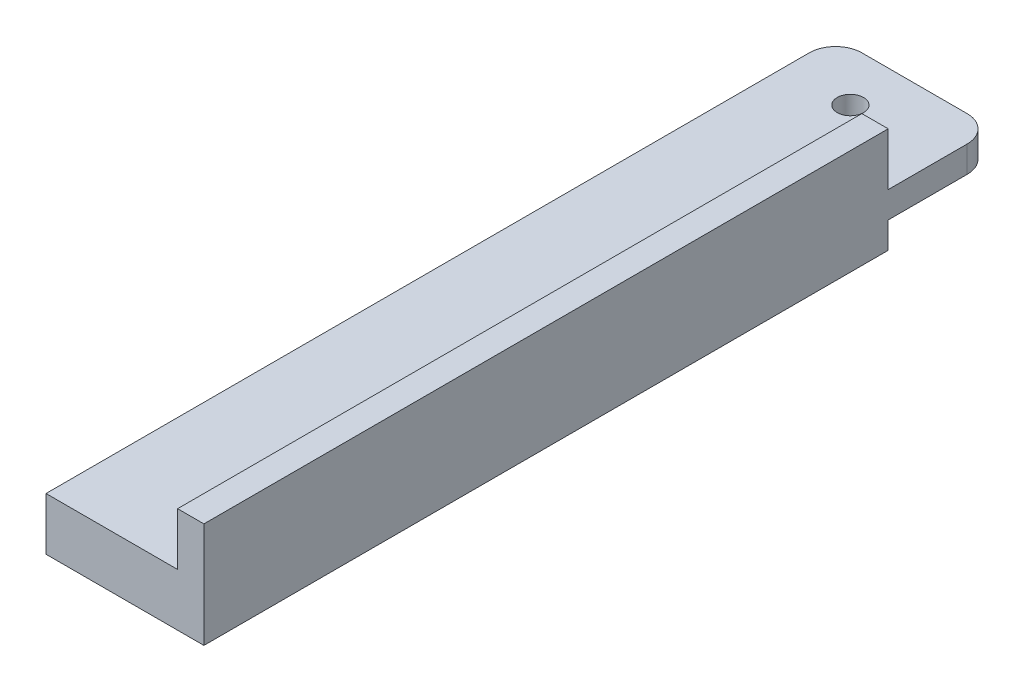
ISO-10303-21;
HEADER;
FILE_DESCRIPTION(('STEP AP214'),'2;1');
FILE_NAME('part.step','',(''),(''),'','','');
FILE_SCHEMA(('AUTOMOTIVE_DESIGN { 1 0 10303 214 1 1 1 1 }'));
ENDSEC;
DATA;
#1=APPLICATION_CONTEXT('core data for automotive mechanical design processes');
#2=APPLICATION_PROTOCOL_DEFINITION('international standard','automotive_design',2000,#1);
#3=PRODUCT_CONTEXT('',#1,'mechanical');
#4=PRODUCT('Part','Part','',(#3));
#5=PRODUCT_RELATED_PRODUCT_CATEGORY('part','',(#4));
#6=PRODUCT_DEFINITION_FORMATION('','',#4);
#7=PRODUCT_DEFINITION_CONTEXT('part definition',#1,'design');
#8=PRODUCT_DEFINITION('design','',#6,#7);
#9=PRODUCT_DEFINITION_SHAPE('','',#8);
#10=(LENGTH_UNIT() NAMED_UNIT(*) SI_UNIT(.MILLI.,.METRE.));
#11=(NAMED_UNIT(*) PLANE_ANGLE_UNIT() SI_UNIT($,.RADIAN.));
#12=(NAMED_UNIT(*) SI_UNIT($,.STERADIAN.) SOLID_ANGLE_UNIT());
#13=UNCERTAINTY_MEASURE_WITH_UNIT(LENGTH_MEASURE(1.E-05),#10,'distance_accuracy_value','');
#14=(GEOMETRIC_REPRESENTATION_CONTEXT(3) GLOBAL_UNCERTAINTY_ASSIGNED_CONTEXT((#13)) GLOBAL_UNIT_ASSIGNED_CONTEXT((#10,
#11,#12)) REPRESENTATION_CONTEXT('',''));
#15=CARTESIAN_POINT('',(0.,0.,0.));
#16=DIRECTION('',(0.,0.,1.));
#17=DIRECTION('',(1.,0.,0.));
#18=AXIS2_PLACEMENT_3D('',#15,#16,#17);
#19=CARTESIAN_POINT('',(10.,0.,300.));
#20=DIRECTION('',(0.,-1.,0.));
#21=DIRECTION('',(1.,0.,0.));
#22=AXIS2_PLACEMENT_3D('',#19,#20,#21);
#23=PLANE('',#22);
#24=DIRECTION('',(-1.,0.,0.));
#25=VECTOR('',#24,1.);
#26=CARTESIAN_POINT('',(10.,0.,300.));
#27=LINE('',#26,#25);
#28=CARTESIAN_POINT('',(0.,0.,300.));
#29=VERTEX_POINT('',#28);
#30=CARTESIAN_POINT('',(-10.,0.,300.));
#31=VERTEX_POINT('',#30);
#32=EDGE_CURVE('E152',#29,#31,#27,.T.);
#33=ORIENTED_EDGE('',*,*,#32,.F.);
#34=DIRECTION('',(0.,0.,1.));
#35=VECTOR('',#34,1.);
#36=CARTESIAN_POINT('',(0.,0.,-26.7380079323497));
#37=LINE('',#36,#35);
#38=CARTESIAN_POINT('',(0.,0.,40.));
#39=VERTEX_POINT('',#38);
#40=EDGE_CURVE('E130',#39,#29,#37,.T.);
#41=ORIENTED_EDGE('',*,*,#40,.F.);
#42=DIRECTION('',(1.,0.,0.));
#43=VECTOR('',#42,1.);
#44=CARTESIAN_POINT('',(0.,0.,40.));
#45=LINE('',#44,#43);
#46=CARTESIAN_POINT('',(-10.,0.,40.));
#47=VERTEX_POINT('',#46);
#48=EDGE_CURVE('E207',#47,#39,#45,.T.);
#49=ORIENTED_EDGE('',*,*,#48,.F.);
#50=DIRECTION('',(0.,0.,-1.));
#51=VECTOR('',#50,1.);
#52=CARTESIAN_POINT('',(-10.,0.,300.));
#53=LINE('',#52,#51);
#54=EDGE_CURVE('E200',#31,#47,#53,.T.);
#55=ORIENTED_EDGE('',*,*,#54,.F.);
#56=EDGE_LOOP('',(#33,#41,#49,#55));
#57=FACE_BOUND('',#56,.T.);
#58=ADVANCED_FACE('F40',(#57),#23,.F.);
#59=CARTESIAN_POINT('',(0.,-40.,300.));
#60=DIRECTION('',(0.,1.,0.));
#61=DIRECTION('',(-1.,0.,0.));
#62=AXIS2_PLACEMENT_3D('',#59,#60,#61);
#63=PLANE('',#62);
#64=DIRECTION('',(-1.,0.,0.));
#65=VECTOR('',#64,1.);
#66=CARTESIAN_POINT('',(60.,-40.,40.));
#67=LINE('',#66,#65);
#68=CARTESIAN_POINT('',(1.04083408558608E-13,-40.,40.));
#69=VERTEX_POINT('',#68);
#70=CARTESIAN_POINT('',(-60.,-40.,40.));
#71=VERTEX_POINT('',#70);
#72=EDGE_CURVE('E143',#69,#71,#67,.T.);
#73=ORIENTED_EDGE('',*,*,#72,.F.);
#74=DIRECTION('',(0.,0.,1.));
#75=VECTOR('',#74,1.);
#76=CARTESIAN_POINT('',(1.01436593500756E-13,-40.0000000000002,-26.7380079323497));
#77=LINE('',#76,#75);
#78=CARTESIAN_POINT('',(1.01540273924714E-13,-40.0000000000002,300.));
#79=VERTEX_POINT('',#78);
#80=EDGE_CURVE('E127',#69,#79,#77,.T.);
#81=ORIENTED_EDGE('',*,*,#80,.T.);
#82=DIRECTION('',(1.,0.,0.));
#83=VECTOR('',#82,1.);
#84=CARTESIAN_POINT('',(0.,-40.,300.));
#85=LINE('',#84,#83);
#86=CARTESIAN_POINT('',(-60.,-40.,300.));
#87=VERTEX_POINT('',#86);
#88=EDGE_CURVE('E141',#87,#79,#85,.T.);
#89=ORIENTED_EDGE('',*,*,#88,.F.);
#90=DIRECTION('',(0.,0.,-1.));
#91=VECTOR('',#90,1.);
#92=CARTESIAN_POINT('',(-60.,-40.,300.));
#93=LINE('',#92,#91);
#94=EDGE_CURVE('E197',#87,#71,#93,.T.);
#95=ORIENTED_EDGE('',*,*,#94,.T.);
#96=EDGE_LOOP('',(#73,#81,#89,#95));
#97=FACE_BOUND('',#96,.T.);
#98=ADVANCED_FACE('F139',(#97),#63,.F.);
#99=CARTESIAN_POINT('',(0.,0.,0.));
#100=DIRECTION('',(0.,0.,1.));
#101=DIRECTION('',(1.,0.,0.));
#102=AXIS2_PLACEMENT_3D('',#99,#100,#101);
#103=PLANE('',#102);
#104=DIRECTION('',(1.,0.,0.));
#105=VECTOR('',#104,1.);
#106=CARTESIAN_POINT('',(10.,-30.,0.));
#107=LINE('',#106,#105);
#108=CARTESIAN_POINT('',(-50.,-30.,0.));
#109=VERTEX_POINT('',#108);
#110=CARTESIAN_POINT('',(-9.99999999999993,-30.,0.));
#111=VERTEX_POINT('',#110);
#112=EDGE_CURVE('E179',#109,#111,#107,.T.);
#113=ORIENTED_EDGE('',*,*,#112,.F.);
#114=DIRECTION('',(0.,1.,0.));
#115=VECTOR('',#114,1.);
#116=CARTESIAN_POINT('',(-50.,-20.,0.));
#117=LINE('',#116,#115);
#118=CARTESIAN_POINT('',(-50.,-20.,0.));
#119=VERTEX_POINT('',#118);
#120=EDGE_CURVE('E168',#109,#119,#117,.T.);
#121=ORIENTED_EDGE('',*,*,#120,.T.);
#122=DIRECTION('',(-1.,0.,0.));
#123=VECTOR('',#122,1.);
#124=CARTESIAN_POINT('',(60.,-19.9999999999999,0.));
#125=LINE('',#124,#123);
#126=CARTESIAN_POINT('',(-9.99999999999995,-20.,0.));
#127=VERTEX_POINT('',#126);
#128=EDGE_CURVE('E156',#127,#119,#125,.T.);
#129=ORIENTED_EDGE('',*,*,#128,.F.);
#130=DIRECTION('',(0.,-1.,0.));
#131=VECTOR('',#130,1.);
#132=CARTESIAN_POINT('',(-10.,0.,0.));
#133=LINE('',#132,#131);
#134=EDGE_CURVE('E154',#127,#111,#133,.T.);
#135=ORIENTED_EDGE('',*,*,#134,.T.);
#136=EDGE_LOOP('',(#113,#121,#129,#135));
#137=FACE_BOUND('',#136,.T.);
#138=ADVANCED_FACE('F184',(#137),#103,.F.);
#139=CARTESIAN_POINT('',(-9.99999999999999,-20.,300.));
#140=DIRECTION('',(-1.,0.,0.));
#141=DIRECTION('',(0.,-1.,0.));
#142=AXIS2_PLACEMENT_3D('',#139,#140,#141);
#143=PLANE('',#142);
#144=ORIENTED_EDGE('',*,*,#54,.T.);
#145=DIRECTION('',(0.,-1.,0.));
#146=VECTOR('',#145,1.);
#147=CARTESIAN_POINT('',(-10.,0.,40.));
#148=LINE('',#147,#146);
#149=CARTESIAN_POINT('',(-9.99999999999999,-20.,40.));
#150=VERTEX_POINT('',#149);
#151=EDGE_CURVE('E164',#47,#150,#148,.T.);
#152=ORIENTED_EDGE('',*,*,#151,.T.);
#153=DIRECTION('',(0.,0.,-1.));
#154=VECTOR('',#153,1.);
#155=CARTESIAN_POINT('',(-9.99999999999999,-20.,300.));
#156=LINE('',#155,#154);
#157=CARTESIAN_POINT('',(-9.99999999999999,-20.,300.));
#158=VERTEX_POINT('',#157);
#159=EDGE_CURVE('E196',#158,#150,#156,.T.);
#160=ORIENTED_EDGE('',*,*,#159,.F.);
#161=DIRECTION('',(0.,1.,0.));
#162=VECTOR('',#161,1.);
#163=CARTESIAN_POINT('',(-9.99999999999999,-20.,300.));
#164=LINE('',#163,#162);
#165=EDGE_CURVE('E227',#158,#31,#164,.T.);
#166=ORIENTED_EDGE('',*,*,#165,.T.);
#167=EDGE_LOOP('',(#144,#152,#160,#166));
#168=FACE_BOUND('',#167,.T.);
#169=ADVANCED_FACE('F220',(#168),#143,.T.);
#170=CARTESIAN_POINT('',(-60.,-40.,300.));
#171=DIRECTION('',(-1.,0.,0.));
#172=DIRECTION('',(0.,-1.,0.));
#173=AXIS2_PLACEMENT_3D('',#170,#171,#172);
#174=PLANE('',#173);
#175=DIRECTION('',(0.,0.,-1.));
#176=VECTOR('',#175,1.);
#177=CARTESIAN_POINT('',(-60.,-20.,300.));
#178=LINE('',#177,#176);
#179=CARTESIAN_POINT('',(-60.,-20.,300.));
#180=VERTEX_POINT('',#179);
#181=CARTESIAN_POINT('',(-60.,-20.,10.));
#182=VERTEX_POINT('',#181);
#183=EDGE_CURVE('E194',#180,#182,#178,.T.);
#184=ORIENTED_EDGE('',*,*,#183,.T.);
#185=DIRECTION('',(0.,1.,0.));
#186=VECTOR('',#185,1.);
#187=CARTESIAN_POINT('',(-60.,-30.,10.));
#188=LINE('',#187,#186);
#189=CARTESIAN_POINT('',(-60.,-30.,10.));
#190=VERTEX_POINT('',#189);
#191=EDGE_CURVE('E63',#182,#190,#188,.F.);
#192=ORIENTED_EDGE('',*,*,#191,.T.);
#193=DIRECTION('',(0.,0.,-1.));
#194=VECTOR('',#193,1.);
#195=CARTESIAN_POINT('',(-60.,-30.,40.));
#196=LINE('',#195,#194);
#197=CARTESIAN_POINT('',(-60.,-30.,40.));
#198=VERTEX_POINT('',#197);
#199=EDGE_CURVE('E180',#198,#190,#196,.T.);
#200=ORIENTED_EDGE('',*,*,#199,.F.);
#201=DIRECTION('',(0.,-1.,0.));
#202=VECTOR('',#201,1.);
#203=CARTESIAN_POINT('',(-60.,-30.,40.));
#204=LINE('',#203,#202);
#205=EDGE_CURVE('E224',#198,#71,#204,.T.);
#206=ORIENTED_EDGE('',*,*,#205,.T.);
#207=ORIENTED_EDGE('',*,*,#94,.F.);
#208=DIRECTION('',(0.,1.,0.));
#209=VECTOR('',#208,1.);
#210=CARTESIAN_POINT('',(-60.,-40.,300.));
#211=LINE('',#210,#209);
#212=EDGE_CURVE('E150',#87,#180,#211,.T.);
#213=ORIENTED_EDGE('',*,*,#212,.T.);
#214=EDGE_LOOP('',(#184,#192,#200,#206,#207,#213));
#215=FACE_BOUND('',#214,.T.);
#216=ADVANCED_FACE('F195',(#215),#174,.T.);
#217=CARTESIAN_POINT('',(60.,-19.9999999999999,300.));
#218=DIRECTION('',(0.,-1.,0.));
#219=DIRECTION('',(1.,0.,0.));
#220=AXIS2_PLACEMENT_3D('',#217,#218,#219);
#221=PLANE('',#220);
#222=CARTESIAN_POINT('',(-35.,-20.,19.3649167310371));
#223=DIRECTION('',(0.,-1.,0.));
#224=DIRECTION('',(1.,0.,0.));
#225=AXIS2_PLACEMENT_3D('',#222,#223,#224);
#226=CIRCLE('',#225,5.);
#227=CARTESIAN_POINT('',(-30.,-20.,19.3649167310371));
#228=VERTEX_POINT('',#227);
#229=EDGE_CURVE('E134',#228,#228,#226,.T.);
#230=ORIENTED_EDGE('',*,*,#229,.T.);
#231=EDGE_LOOP('',(#230));
#232=FACE_BOUND('',#231,.T.);
#233=ORIENTED_EDGE('',*,*,#128,.T.);
#234=CARTESIAN_POINT('',(-50.,-20.,10.));
#235=DIRECTION('',(0.,-1.,0.));
#236=DIRECTION('',(1.,0.,0.));
#237=AXIS2_PLACEMENT_3D('',#234,#235,#236);
#238=CIRCLE('',#237,10.);
#239=EDGE_CURVE('E173',#119,#182,#238,.F.);
#240=ORIENTED_EDGE('',*,*,#239,.T.);
#241=ORIENTED_EDGE('',*,*,#183,.F.);
#242=DIRECTION('',(1.,0.,0.));
#243=VECTOR('',#242,1.);
#244=CARTESIAN_POINT('',(-60.,-20.,300.));
#245=LINE('',#244,#243);
#246=EDGE_CURVE('E226',#180,#158,#245,.T.);
#247=ORIENTED_EDGE('',*,*,#246,.T.);
#248=ORIENTED_EDGE('',*,*,#159,.T.);
#249=DIRECTION('',(-1.,0.,0.));
#250=VECTOR('',#249,1.);
#251=CARTESIAN_POINT('',(10.,-20.,40.));
#252=LINE('',#251,#250);
#253=CARTESIAN_POINT('',(0.,-19.9999999999999,40.));
#254=VERTEX_POINT('',#253);
#255=EDGE_CURVE('E188',#254,#150,#252,.T.);
#256=ORIENTED_EDGE('',*,*,#255,.F.);
#257=DIRECTION('',(0.,0.,-1.));
#258=VECTOR('',#257,1.);
#259=CARTESIAN_POINT('',(0.,-19.9999999999999,300.));
#260=LINE('',#259,#258);
#261=CARTESIAN_POINT('',(0.,-19.9999999999999,10.));
#262=VERTEX_POINT('',#261);
#263=EDGE_CURVE('E237',#254,#262,#260,.T.);
#264=ORIENTED_EDGE('',*,*,#263,.T.);
#265=CARTESIAN_POINT('',(-9.99999999999995,-20.,10.));
#266=DIRECTION('',(0.,-1.,0.));
#267=DIRECTION('',(1.,0.,0.));
#268=AXIS2_PLACEMENT_3D('',#265,#266,#267);
#269=CIRCLE('',#268,10.);
#270=EDGE_CURVE('E171',#262,#127,#269,.F.);
#271=ORIENTED_EDGE('',*,*,#270,.T.);
#272=EDGE_LOOP('',(#233,#240,#241,#247,#248,#256,#264,#271));
#273=FACE_BOUND('',#272,.T.);
#274=ADVANCED_FACE('F192',(#232,#273),#221,.F.);
#275=CARTESIAN_POINT('',(0.,0.,300.));
#276=DIRECTION('',(0.,0.,1.));
#277=DIRECTION('',(1.,0.,0.));
#278=AXIS2_PLACEMENT_3D('',#275,#276,#277);
#279=PLANE('',#278);
#280=DIRECTION('',(0.,-1.,0.));
#281=VECTOR('',#280,1.);
#282=CARTESIAN_POINT('',(0.,0.,300.));
#283=LINE('',#282,#281);
#284=EDGE_CURVE('E123',#29,#79,#283,.T.);
#285=ORIENTED_EDGE('',*,*,#284,.F.);
#286=ORIENTED_EDGE('',*,*,#32,.T.);
#287=ORIENTED_EDGE('',*,*,#165,.F.);
#288=ORIENTED_EDGE('',*,*,#246,.F.);
#289=ORIENTED_EDGE('',*,*,#212,.F.);
#290=ORIENTED_EDGE('',*,*,#88,.T.);
#291=EDGE_LOOP('',(#285,#286,#287,#288,#289,#290));
#292=FACE_BOUND('',#291,.T.);
#293=ADVANCED_FACE('F147',(#292),#279,.T.);
#294=CARTESIAN_POINT('',(0.,0.,40.));
#295=DIRECTION('',(0.,0.,-1.));
#296=DIRECTION('',(-1.,0.,0.));
#297=AXIS2_PLACEMENT_3D('',#294,#295,#296);
#298=PLANE('',#297);
#299=DIRECTION('',(0.,1.,0.));
#300=VECTOR('',#299,1.);
#301=CARTESIAN_POINT('',(0.,0.,40.));
#302=LINE('',#301,#300);
#303=EDGE_CURVE('E135',#254,#39,#302,.T.);
#304=ORIENTED_EDGE('',*,*,#303,.F.);
#305=ORIENTED_EDGE('',*,*,#255,.T.);
#306=ORIENTED_EDGE('',*,*,#151,.F.);
#307=ORIENTED_EDGE('',*,*,#48,.T.);
#308=EDGE_LOOP('',(#304,#305,#306,#307));
#309=FACE_BOUND('',#308,.T.);
#310=ADVANCED_FACE('F217',(#309),#298,.T.);
#311=CARTESIAN_POINT('',(10.,-30.,40.));
#312=DIRECTION('',(0.,1.,0.));
#313=DIRECTION('',(0.,0.,1.));
#314=AXIS2_PLACEMENT_3D('',#311,#312,#313);
#315=PLANE('',#314);
#316=CARTESIAN_POINT('',(-35.,-30.,19.3649167310371));
#317=DIRECTION('',(0.,1.,0.));
#318=DIRECTION('',(0.,0.,1.));
#319=AXIS2_PLACEMENT_3D('',#316,#317,#318);
#320=CIRCLE('',#319,5.);
#321=CARTESIAN_POINT('',(-35.,-30.,24.3649167310371));
#322=VERTEX_POINT('',#321);
#323=EDGE_CURVE('E162',#322,#322,#320,.F.);
#324=ORIENTED_EDGE('',*,*,#323,.F.);
#325=EDGE_LOOP('',(#324));
#326=FACE_BOUND('',#325,.T.);
#327=ORIENTED_EDGE('',*,*,#199,.T.);
#328=CARTESIAN_POINT('',(-50.,-30.,10.));
#329=DIRECTION('',(0.,1.,0.));
#330=DIRECTION('',(0.,0.,1.));
#331=AXIS2_PLACEMENT_3D('',#328,#329,#330);
#332=CIRCLE('',#331,10.);
#333=EDGE_CURVE('E48',#190,#109,#332,.F.);
#334=ORIENTED_EDGE('',*,*,#333,.T.);
#335=ORIENTED_EDGE('',*,*,#112,.T.);
#336=CARTESIAN_POINT('',(-9.99999999999993,-30.,10.));
#337=DIRECTION('',(0.,1.,0.));
#338=DIRECTION('',(0.,0.,1.));
#339=AXIS2_PLACEMENT_3D('',#336,#337,#338);
#340=CIRCLE('',#339,10.);
#341=CARTESIAN_POINT('',(0.,-30.,10.));
#342=VERTEX_POINT('',#341);
#343=EDGE_CURVE('E55',#111,#342,#340,.F.);
#344=ORIENTED_EDGE('',*,*,#343,.T.);
#345=DIRECTION('',(0.,0.,1.));
#346=VECTOR('',#345,1.);
#347=CARTESIAN_POINT('',(0.,-30.,40.));
#348=LINE('',#347,#346);
#349=CARTESIAN_POINT('',(0.,-30.,40.));
#350=VERTEX_POINT('',#349);
#351=EDGE_CURVE('E144',#342,#350,#348,.T.);
#352=ORIENTED_EDGE('',*,*,#351,.T.);
#353=DIRECTION('',(1.,0.,0.));
#354=VECTOR('',#353,1.);
#355=CARTESIAN_POINT('',(10.,-30.,40.));
#356=LINE('',#355,#354);
#357=EDGE_CURVE('E187',#198,#350,#356,.T.);
#358=ORIENTED_EDGE('',*,*,#357,.F.);
#359=EDGE_LOOP('',(#327,#334,#335,#344,#352,#358));
#360=FACE_BOUND('',#359,.T.);
#361=ADVANCED_FACE('F178',(#326,#360),#315,.F.);
#362=CARTESIAN_POINT('',(0.,0.,40.));
#363=DIRECTION('',(0.,0.,-1.));
#364=DIRECTION('',(-1.,0.,0.));
#365=AXIS2_PLACEMENT_3D('',#362,#363,#364);
#366=PLANE('',#365);
#367=DIRECTION('',(0.,1.,0.));
#368=VECTOR('',#367,1.);
#369=CARTESIAN_POINT('',(0.,0.,40.));
#370=LINE('',#369,#368);
#371=EDGE_CURVE('E151',#69,#350,#370,.T.);
#372=ORIENTED_EDGE('',*,*,#371,.F.);
#373=ORIENTED_EDGE('',*,*,#72,.T.);
#374=ORIENTED_EDGE('',*,*,#205,.F.);
#375=ORIENTED_EDGE('',*,*,#357,.T.);
#376=EDGE_LOOP('',(#372,#373,#374,#375));
#377=FACE_BOUND('',#376,.T.);
#378=ADVANCED_FACE('F243',(#377),#366,.T.);
#379=CARTESIAN_POINT('',(-35.,-40.,19.3649167310371));
#380=DIRECTION('',(0.,1.,0.));
#381=DIRECTION('',(-1.,0.,0.));
#382=AXIS2_PLACEMENT_3D('',#379,#380,#381);
#383=CYLINDRICAL_SURFACE('',#382,5.);
#384=ORIENTED_EDGE('',*,*,#229,.F.);
#385=EDGE_LOOP('',(#384));
#386=FACE_BOUND('',#385,.T.);
#387=ORIENTED_EDGE('',*,*,#323,.T.);
#388=EDGE_LOOP('',(#387));
#389=FACE_BOUND('',#388,.T.);
#390=ADVANCED_FACE('F245',(#386,#389),#383,.F.);
#391=CARTESIAN_POINT('',(1.01436593500756E-13,-40.0000000000002,-26.7380079323497));
#392=DIRECTION('',(-1.,0.,0.));
#393=DIRECTION('',(0.,-1.,0.));
#394=AXIS2_PLACEMENT_3D('',#391,#392,#393);
#395=PLANE('',#394);
#396=ORIENTED_EDGE('',*,*,#351,.F.);
#397=DIRECTION('',(0.,-1.,0.));
#398=VECTOR('',#397,1.);
#399=CARTESIAN_POINT('',(1.01448251196358E-13,-40.0000000000002,10.));
#400=LINE('',#399,#398);
#401=EDGE_CURVE('E11',#342,#262,#400,.F.);
#402=ORIENTED_EDGE('',*,*,#401,.T.);
#403=ORIENTED_EDGE('',*,*,#263,.F.);
#404=ORIENTED_EDGE('',*,*,#303,.T.);
#405=ORIENTED_EDGE('',*,*,#40,.T.);
#406=ORIENTED_EDGE('',*,*,#284,.T.);
#407=ORIENTED_EDGE('',*,*,#80,.F.);
#408=ORIENTED_EDGE('',*,*,#371,.T.);
#409=EDGE_LOOP('',(#396,#402,#403,#404,#405,#406,#407,#408));
#410=FACE_BOUND('',#409,.T.);
#411=ADVANCED_FACE('F125',(#410),#395,.F.);
#412=CARTESIAN_POINT('',(-50.,0.,10.));
#413=DIRECTION('',(0.,-1.,0.));
#414=DIRECTION('',(1.,0.,0.));
#415=AXIS2_PLACEMENT_3D('',#412,#413,#414);
#416=CYLINDRICAL_SURFACE('',#415,10.);
#417=ORIENTED_EDGE('',*,*,#333,.F.);
#418=ORIENTED_EDGE('',*,*,#191,.F.);
#419=ORIENTED_EDGE('',*,*,#239,.F.);
#420=ORIENTED_EDGE('',*,*,#120,.F.);
#421=EDGE_LOOP('',(#417,#418,#419,#420));
#422=FACE_BOUND('',#421,.T.);
#423=ADVANCED_FACE('F190',(#422),#416,.T.);
#424=CARTESIAN_POINT('',(-10.,0.,10.));
#425=DIRECTION('',(0.,-1.,0.));
#426=DIRECTION('',(1.,0.,0.));
#427=AXIS2_PLACEMENT_3D('',#424,#425,#426);
#428=CYLINDRICAL_SURFACE('',#427,10.);
#429=ORIENTED_EDGE('',*,*,#270,.F.);
#430=ORIENTED_EDGE('',*,*,#401,.F.);
#431=ORIENTED_EDGE('',*,*,#343,.F.);
#432=ORIENTED_EDGE('',*,*,#134,.F.);
#433=EDGE_LOOP('',(#429,#430,#431,#432));
#434=FACE_BOUND('',#433,.T.);
#435=ADVANCED_FACE('F42',(#434),#428,.T.);
#436=CLOSED_SHELL('',(#58,#98,#138,#169,#216,#274,#293,#310,#361,#378,#390,#411,#423,#435));
#437=MANIFOLD_SOLID_BREP('B2',#436);
#438=ADVANCED_BREP_SHAPE_REPRESENTATION('',(#18,#437),#14);
#439=SHAPE_DEFINITION_REPRESENTATION(#9,#438);
ENDSEC;
END-ISO-10303-21;
